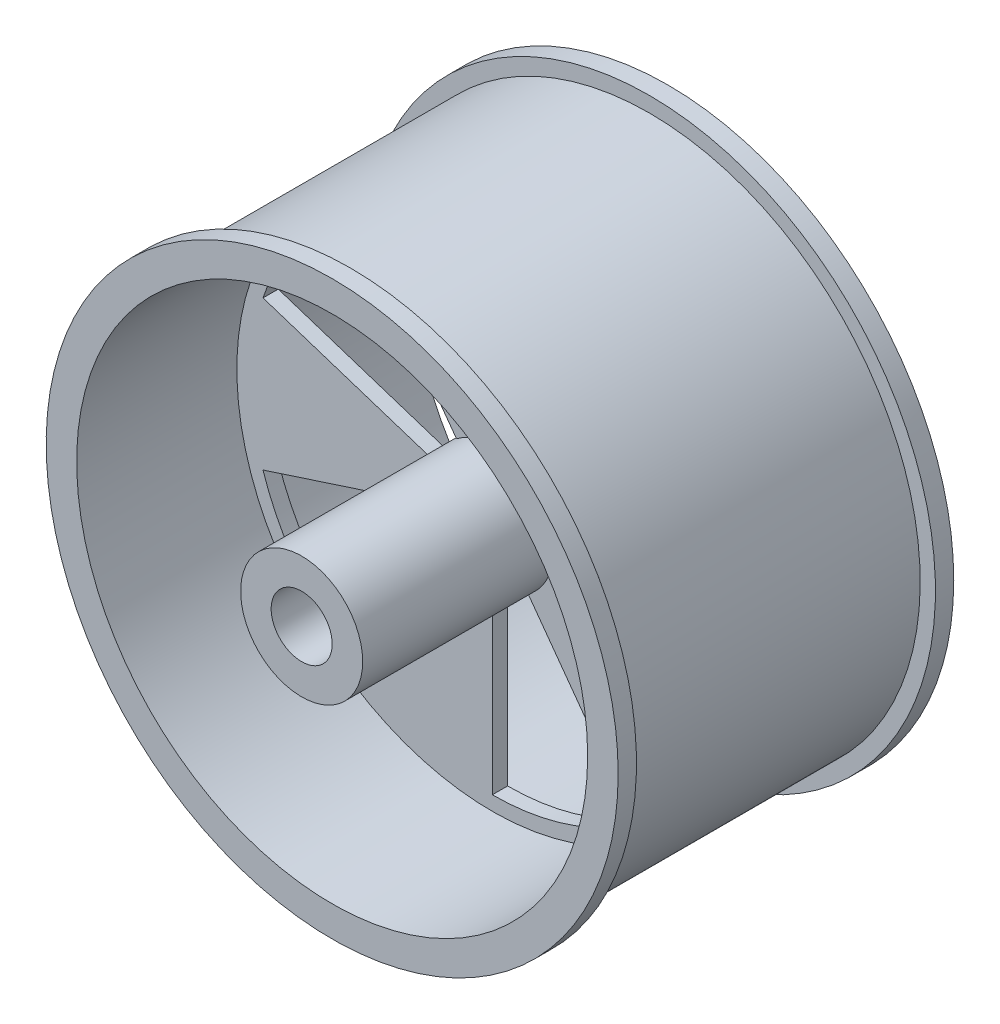
ISO-10303-21;
HEADER;
FILE_DESCRIPTION(('STEP AP214'),'2;1');
FILE_NAME('part.step','',(''),(''),'','','');
FILE_SCHEMA(('AUTOMOTIVE_DESIGN { 1 0 10303 214 1 1 1 1 }'));
ENDSEC;
DATA;
#1=APPLICATION_CONTEXT('core data for automotive mechanical design processes');
#2=APPLICATION_PROTOCOL_DEFINITION('international standard','automotive_design',2000,#1);
#3=PRODUCT_CONTEXT('',#1,'mechanical');
#4=PRODUCT('Part','Part','',(#3));
#5=PRODUCT_RELATED_PRODUCT_CATEGORY('part','',(#4));
#6=PRODUCT_DEFINITION_FORMATION('','',#4);
#7=PRODUCT_DEFINITION_CONTEXT('part definition',#1,'design');
#8=PRODUCT_DEFINITION('design','',#6,#7);
#9=PRODUCT_DEFINITION_SHAPE('','',#8);
#10=(LENGTH_UNIT() NAMED_UNIT(*) SI_UNIT(.MILLI.,.METRE.));
#11=(NAMED_UNIT(*) PLANE_ANGLE_UNIT() SI_UNIT($,.RADIAN.));
#12=(NAMED_UNIT(*) SI_UNIT($,.STERADIAN.) SOLID_ANGLE_UNIT());
#13=UNCERTAINTY_MEASURE_WITH_UNIT(LENGTH_MEASURE(1.E-05),#10,'distance_accuracy_value','');
#14=(GEOMETRIC_REPRESENTATION_CONTEXT(3) GLOBAL_UNCERTAINTY_ASSIGNED_CONTEXT((#13)) GLOBAL_UNIT_ASSIGNED_CONTEXT((#10,
#11,#12)) REPRESENTATION_CONTEXT('',''));
#15=CARTESIAN_POINT('',(0.,0.,0.));
#16=DIRECTION('',(0.,0.,1.));
#17=DIRECTION('',(1.,0.,0.));
#18=AXIS2_PLACEMENT_3D('',#15,#16,#17);
#19=CARTESIAN_POINT('',(0.,0.,14.605));
#20=DIRECTION('',(0.,0.,1.));
#21=DIRECTION('',(1.,0.,0.));
#22=AXIS2_PLACEMENT_3D('',#19,#20,#21);
#23=PLANE('',#22);
#24=CARTESIAN_POINT('',(0.,0.,14.605));
#25=DIRECTION('',(0.,0.,1.));
#26=DIRECTION('',(1.,0.,0.));
#27=AXIS2_PLACEMENT_3D('',#24,#25,#26);
#28=CIRCLE('',#27,21.2725);
#29=CARTESIAN_POINT('',(21.2725,0.,14.605));
#30=VERTEX_POINT('',#29);
#31=EDGE_CURVE('E377',#30,#30,#28,.T.);
#32=ORIENTED_EDGE('',*,*,#31,.T.);
#33=EDGE_LOOP('',(#32));
#34=FACE_BOUND('',#33,.T.);
#35=DIRECTION('',(0.951056516295152,-0.309016994374953,0.));
#36=VECTOR('',#35,1.);
#37=CARTESIAN_POINT('',(0.,0.,14.605));
#38=LINE('',#37,#36);
#39=CARTESIAN_POINT('',(4.83136710277938,-1.56980633142474,14.605));
#40=VERTEX_POINT('',#39);
#41=CARTESIAN_POINT('',(19.0936857187198,-6.20391456369309,14.605));
#42=VERTEX_POINT('',#41);
#43=EDGE_CURVE('E205',#40,#42,#38,.T.);
#44=ORIENTED_EDGE('',*,*,#43,.F.);
#45=CARTESIAN_POINT('',(0.,0.,14.605));
#46=DIRECTION('',(0.,0.,1.));
#47=DIRECTION('',(1.,0.,0.));
#48=AXIS2_PLACEMENT_3D('',#45,#46,#47);
#49=CIRCLE('',#48,5.08);
#50=CARTESIAN_POINT('',(2.98594908164576,-4.10980633142473,14.605));
#51=VERTEX_POINT('',#50);
#52=EDGE_CURVE('E196',#51,#40,#49,.T.);
#53=ORIENTED_EDGE('',*,*,#52,.F.);
#54=DIRECTION('',(-0.587785252292467,0.809016994374952,0.));
#55=VECTOR('',#54,1.);
#56=CARTESIAN_POINT('',(0.,0.,14.605));
#57=LINE('',#56,#55);
#58=CARTESIAN_POINT('',(11.8005467446771,-16.2420591910488,14.605));
#59=VERTEX_POINT('',#58);
#60=EDGE_CURVE('E394',#59,#51,#57,.T.);
#61=ORIENTED_EDGE('',*,*,#60,.F.);
#62=CARTESIAN_POINT('',(0.,0.,14.605));
#63=DIRECTION('',(0.,0.,1.));
#64=DIRECTION('',(1.,0.,0.));
#65=AXIS2_PLACEMENT_3D('',#62,#63,#64);
#66=CIRCLE('',#65,20.0762892547115);
#67=CARTESIAN_POINT('',(-1.42681005899092E-13,-20.0762892547115,14.605));
#68=VERTEX_POINT('',#67);
#69=EDGE_CURVE('E206',#68,#59,#66,.T.);
#70=ORIENTED_EDGE('',*,*,#69,.F.);
#71=DIRECTION('',(0.,-1.,0.));
#72=VECTOR('',#71,1.);
#73=CARTESIAN_POINT('',(0.,0.,14.605));
#74=LINE('',#73,#72);
#75=CARTESIAN_POINT('',(0.,-5.08,14.605));
#76=VERTEX_POINT('',#75);
#77=EDGE_CURVE('E398',#76,#68,#74,.T.);
#78=ORIENTED_EDGE('',*,*,#77,.F.);
#79=CARTESIAN_POINT('',(-2.98594908164576,-4.10980633142473,14.605));
#80=VERTEX_POINT('',#79);
#81=EDGE_CURVE('E732',#80,#76,#49,.T.);
#82=ORIENTED_EDGE('',*,*,#81,.F.);
#83=DIRECTION('',(0.587785252292483,0.80901699437494,0.));
#84=VECTOR('',#83,1.);
#85=CARTESIAN_POINT('',(0.,0.,14.605));
#86=LINE('',#85,#84);
#87=CARTESIAN_POINT('',(-11.8005467446775,-16.2420591910487,14.605));
#88=VERTEX_POINT('',#87);
#89=EDGE_CURVE('E409',#88,#80,#86,.T.);
#90=ORIENTED_EDGE('',*,*,#89,.F.);
#91=CARTESIAN_POINT('',(0.,0.,14.605));
#92=DIRECTION('',(0.,0.,1.));
#93=DIRECTION('',(1.,0.,0.));
#94=AXIS2_PLACEMENT_3D('',#91,#92,#93);
#95=CIRCLE('',#94,20.0762892547115);
#96=CARTESIAN_POINT('',(-19.0936857187198,-6.20391456369282,14.605));
#97=VERTEX_POINT('',#96);
#98=EDGE_CURVE('E415',#97,#88,#95,.T.);
#99=ORIENTED_EDGE('',*,*,#98,.F.);
#100=DIRECTION('',(-0.951056516295158,-0.309016994374935,0.));
#101=VECTOR('',#100,1.);
#102=CARTESIAN_POINT('',(0.,0.,14.605));
#103=LINE('',#102,#101);
#104=CARTESIAN_POINT('',(-4.83136710277938,-1.56980633142473,14.605));
#105=VERTEX_POINT('',#104);
#106=EDGE_CURVE('E412',#105,#97,#103,.T.);
#107=ORIENTED_EDGE('',*,*,#106,.F.);
#108=CARTESIAN_POINT('',(-4.83136710277938,1.56980633142473,14.605));
#109=VERTEX_POINT('',#108);
#110=EDGE_CURVE('E433',#109,#105,#49,.T.);
#111=ORIENTED_EDGE('',*,*,#110,.F.);
#112=DIRECTION('',(0.951056516295149,-0.309016994374962,0.));
#113=VECTOR('',#112,1.);
#114=CARTESIAN_POINT('',(0.,0.,14.605));
#115=LINE('',#114,#113);
#116=CARTESIAN_POINT('',(-19.0936857187197,6.20391456369331,14.605));
#117=VERTEX_POINT('',#116);
#118=EDGE_CURVE('E419',#117,#109,#115,.T.);
#119=ORIENTED_EDGE('',*,*,#118,.F.);
#120=CARTESIAN_POINT('',(0.,0.,14.605));
#121=DIRECTION('',(0.,0.,1.));
#122=DIRECTION('',(1.,0.,0.));
#123=AXIS2_PLACEMENT_3D('',#120,#121,#122);
#124=CIRCLE('',#123,20.0762892547115);
#125=CARTESIAN_POINT('',(-11.8005467446771,16.2420591910489,14.605));
#126=VERTEX_POINT('',#125);
#127=EDGE_CURVE('E12',#126,#117,#124,.T.);
#128=ORIENTED_EDGE('',*,*,#127,.F.);
#129=DIRECTION('',(-0.58778525229246,0.809016994374957,0.));
#130=VECTOR('',#129,1.);
#131=CARTESIAN_POINT('',(0.,0.,14.605));
#132=LINE('',#131,#130);
#133=CARTESIAN_POINT('',(-2.98594908164576,4.10980633142474,14.605));
#134=VERTEX_POINT('',#133);
#135=EDGE_CURVE('E50',#134,#126,#132,.T.);
#136=ORIENTED_EDGE('',*,*,#135,.F.);
#137=CARTESIAN_POINT('',(0.,5.08,14.605));
#138=VERTEX_POINT('',#137);
#139=EDGE_CURVE('E194',#138,#134,#49,.T.);
#140=ORIENTED_EDGE('',*,*,#139,.F.);
#141=DIRECTION('',(0.,-1.,0.));
#142=VECTOR('',#141,1.);
#143=CARTESIAN_POINT('',(0.,0.,14.605));
#144=LINE('',#143,#142);
#145=CARTESIAN_POINT('',(0.,20.0762892547115,14.605));
#146=VERTEX_POINT('',#145);
#147=EDGE_CURVE('E384',#146,#138,#144,.T.);
#148=ORIENTED_EDGE('',*,*,#147,.F.);
#149=CARTESIAN_POINT('',(0.,0.,14.605));
#150=DIRECTION('',(0.,0.,1.));
#151=DIRECTION('',(1.,0.,0.));
#152=AXIS2_PLACEMENT_3D('',#149,#150,#151);
#153=CIRCLE('',#152,20.0762892547115);
#154=CARTESIAN_POINT('',(11.8005467446773,16.2420591910488,14.605));
#155=VERTEX_POINT('',#154);
#156=EDGE_CURVE('E390',#155,#146,#153,.T.);
#157=ORIENTED_EDGE('',*,*,#156,.F.);
#158=DIRECTION('',(0.587785252292474,0.809016994374947,0.));
#159=VECTOR('',#158,1.);
#160=CARTESIAN_POINT('',(0.,0.,14.605));
#161=LINE('',#160,#159);
#162=CARTESIAN_POINT('',(2.98594908164577,4.10980633142473,14.605));
#163=VERTEX_POINT('',#162);
#164=EDGE_CURVE('E187',#163,#155,#161,.T.);
#165=ORIENTED_EDGE('',*,*,#164,.F.);
#166=CARTESIAN_POINT('',(4.83136710277938,1.56980633142473,14.605));
#167=VERTEX_POINT('',#166);
#168=EDGE_CURVE('E181',#167,#163,#49,.T.);
#169=ORIENTED_EDGE('',*,*,#168,.F.);
#170=DIRECTION('',(-0.951056516295155,-0.309016994374944,0.));
#171=VECTOR('',#170,1.);
#172=CARTESIAN_POINT('',(0.,0.,14.605));
#173=LINE('',#172,#171);
#174=CARTESIAN_POINT('',(19.0936857187198,6.20391456369294,14.605));
#175=VERTEX_POINT('',#174);
#176=EDGE_CURVE('E185',#175,#167,#173,.T.);
#177=ORIENTED_EDGE('',*,*,#176,.F.);
#178=CARTESIAN_POINT('',(0.,0.,14.605));
#179=DIRECTION('',(0.,0.,1.));
#180=DIRECTION('',(1.,0.,0.));
#181=AXIS2_PLACEMENT_3D('',#178,#179,#180);
#182=CIRCLE('',#181,20.0762892547115);
#183=EDGE_CURVE('E406',#42,#175,#182,.T.);
#184=ORIENTED_EDGE('',*,*,#183,.F.);
#185=EDGE_LOOP('',(#44,#53,#61,#70,#78,#82,#90,#99,#107,#111,#119,#128,#136,#140,#148,#157,#165,
#169,#177,#184));
#186=FACE_BOUND('',#185,.T.);
#187=ADVANCED_FACE('F41',(#34,#186),#23,.T.);
#188=CARTESIAN_POINT('',(0.,0.,27.94));
#189=DIRECTION('',(0.,0.,-1.));
#190=DIRECTION('',(-1.,0.,0.));
#191=AXIS2_PLACEMENT_3D('',#188,#189,#190);
#192=CYLINDRICAL_SURFACE('',#191,21.2725);
#193=CARTESIAN_POINT('',(0.,0.,0.));
#194=DIRECTION('',(0.,0.,1.));
#195=DIRECTION('',(1.,0.,0.));
#196=AXIS2_PLACEMENT_3D('',#193,#194,#195);
#197=CIRCLE('',#196,21.2725);
#198=CARTESIAN_POINT('',(21.2725,0.,0.));
#199=VERTEX_POINT('',#198);
#200=EDGE_CURVE('E364',#199,#199,#197,.T.);
#201=ORIENTED_EDGE('',*,*,#200,.F.);
#202=EDGE_LOOP('',(#201));
#203=FACE_BOUND('',#202,.T.);
#204=CARTESIAN_POINT('',(0.,0.,13.335));
#205=DIRECTION('',(0.,0.,1.));
#206=DIRECTION('',(1.,0.,0.));
#207=AXIS2_PLACEMENT_3D('',#204,#205,#206);
#208=CIRCLE('',#207,21.2725);
#209=CARTESIAN_POINT('',(21.2725,0.,13.335));
#210=VERTEX_POINT('',#209);
#211=EDGE_CURVE('E344',#210,#210,#208,.T.);
#212=ORIENTED_EDGE('',*,*,#211,.T.);
#213=EDGE_LOOP('',(#212));
#214=FACE_BOUND('',#213,.T.);
#215=ADVANCED_FACE('F450',(#203,#214),#192,.F.);
#216=CARTESIAN_POINT('',(0.,0.,27.94));
#217=DIRECTION('',(0.,0.,-1.));
#218=DIRECTION('',(-1.,0.,0.));
#219=AXIS2_PLACEMENT_3D('',#216,#217,#218);
#220=CYLINDRICAL_SURFACE('',#219,23.8125);
#221=CARTESIAN_POINT('',(0.,0.,1.524));
#222=DIRECTION('',(0.,0.,-1.));
#223=DIRECTION('',(0.,1.,0.));
#224=AXIS2_PLACEMENT_3D('',#221,#222,#223);
#225=CIRCLE('',#224,23.8125);
#226=CARTESIAN_POINT('',(0.,23.8125,1.524));
#227=VERTEX_POINT('',#226);
#228=EDGE_CURVE('E348',#227,#227,#225,.T.);
#229=ORIENTED_EDGE('',*,*,#228,.T.);
#230=EDGE_LOOP('',(#229));
#231=FACE_BOUND('',#230,.T.);
#232=CARTESIAN_POINT('',(0.,0.,0.));
#233=DIRECTION('',(0.,0.,1.));
#234=DIRECTION('',(1.,0.,0.));
#235=AXIS2_PLACEMENT_3D('',#232,#233,#234);
#236=CIRCLE('',#235,23.8125);
#237=CARTESIAN_POINT('',(23.8125,0.,0.));
#238=VERTEX_POINT('',#237);
#239=EDGE_CURVE('E369',#238,#238,#236,.T.);
#240=ORIENTED_EDGE('',*,*,#239,.T.);
#241=EDGE_LOOP('',(#240));
#242=FACE_BOUND('',#241,.T.);
#243=ADVANCED_FACE('F452',(#231,#242),#220,.T.);
#244=CARTESIAN_POINT('',(0.,0.,27.94));
#245=DIRECTION('',(0.,0.,1.));
#246=DIRECTION('',(1.,0.,0.));
#247=AXIS2_PLACEMENT_3D('',#244,#245,#246);
#248=PLANE('',#247);
#249=CARTESIAN_POINT('',(0.,0.,27.94));
#250=DIRECTION('',(0.,0.,1.));
#251=DIRECTION('',(1.,0.,0.));
#252=AXIS2_PLACEMENT_3D('',#249,#250,#251);
#253=CIRCLE('',#252,23.8125);
#254=CARTESIAN_POINT('',(23.8125,0.,27.94));
#255=VERTEX_POINT('',#254);
#256=EDGE_CURVE('E373',#255,#255,#253,.T.);
#257=ORIENTED_EDGE('',*,*,#256,.T.);
#258=EDGE_LOOP('',(#257));
#259=FACE_BOUND('',#258,.T.);
#260=CARTESIAN_POINT('',(0.,0.,27.94));
#261=DIRECTION('',(0.,0.,1.));
#262=DIRECTION('',(1.,0.,0.));
#263=AXIS2_PLACEMENT_3D('',#260,#261,#262);
#264=CIRCLE('',#263,21.2725);
#265=CARTESIAN_POINT('',(21.2725,0.,27.94));
#266=VERTEX_POINT('',#265);
#267=EDGE_CURVE('E365',#266,#266,#264,.T.);
#268=ORIENTED_EDGE('',*,*,#267,.F.);
#269=EDGE_LOOP('',(#268));
#270=FACE_BOUND('',#269,.T.);
#271=ADVANCED_FACE('F460',(#259,#270),#248,.T.);
#272=CARTESIAN_POINT('',(0.,0.,0.));
#273=DIRECTION('',(0.,0.,1.));
#274=DIRECTION('',(1.,0.,0.));
#275=AXIS2_PLACEMENT_3D('',#272,#273,#274);
#276=PLANE('',#275);
#277=ORIENTED_EDGE('',*,*,#239,.F.);
#278=EDGE_LOOP('',(#277));
#279=FACE_BOUND('',#278,.T.);
#280=ORIENTED_EDGE('',*,*,#200,.T.);
#281=EDGE_LOOP('',(#280));
#282=FACE_BOUND('',#281,.T.);
#283=ADVANCED_FACE('F476',(#279,#282),#276,.F.);
#284=CARTESIAN_POINT('',(0.,0.,26.416));
#285=DIRECTION('',(0.,0.,-1.));
#286=DIRECTION('',(0.,1.,0.));
#287=AXIS2_PLACEMENT_3D('',#284,#285,#286);
#288=CIRCLE('',#287,23.8125);
#289=CARTESIAN_POINT('',(0.,23.8125,26.416));
#290=VERTEX_POINT('',#289);
#291=EDGE_CURVE('E352',#290,#290,#288,.T.);
#292=ORIENTED_EDGE('',*,*,#291,.F.);
#293=EDGE_LOOP('',(#292));
#294=FACE_BOUND('',#293,.T.);
#295=ORIENTED_EDGE('',*,*,#256,.F.);
#296=EDGE_LOOP('',(#295));
#297=FACE_BOUND('',#296,.T.);
#298=ADVANCED_FACE('F43',(#294,#297),#220,.T.);
#299=ORIENTED_EDGE('',*,*,#31,.F.);
#300=EDGE_LOOP('',(#299));
#301=FACE_BOUND('',#300,.T.);
#302=ORIENTED_EDGE('',*,*,#267,.T.);
#303=EDGE_LOOP('',(#302));
#304=FACE_BOUND('',#303,.T.);
#305=ADVANCED_FACE('F455',(#301,#304),#192,.F.);
#306=CARTESIAN_POINT('',(0.,23.8125,1.524));
#307=DIRECTION('',(0.,0.,-1.));
#308=DIRECTION('',(0.,1.,0.));
#309=AXIS2_PLACEMENT_3D('',#306,#307,#308);
#310=PLANE('',#309);
#311=ORIENTED_EDGE('',*,*,#228,.F.);
#312=EDGE_LOOP('',(#311));
#313=FACE_BOUND('',#312,.T.);
#314=CARTESIAN_POINT('',(0.,0.,1.524));
#315=DIRECTION('',(0.,0.,-1.));
#316=DIRECTION('',(0.,1.,0.));
#317=AXIS2_PLACEMENT_3D('',#314,#315,#316);
#318=CIRCLE('',#317,22.5425);
#319=CARTESIAN_POINT('',(0.,22.5425,1.524));
#320=VERTEX_POINT('',#319);
#321=EDGE_CURVE('E360',#320,#320,#318,.T.);
#322=ORIENTED_EDGE('',*,*,#321,.T.);
#323=EDGE_LOOP('',(#322));
#324=FACE_BOUND('',#323,.T.);
#325=ADVANCED_FACE('F468',(#313,#324),#310,.F.);
#326=CARTESIAN_POINT('',(0.,0.,0.));
#327=DIRECTION('',(0.,0.,-1.));
#328=DIRECTION('',(0.,1.,0.));
#329=AXIS2_PLACEMENT_3D('',#326,#327,#328);
#330=CYLINDRICAL_SURFACE('',#329,22.5425);
#331=ORIENTED_EDGE('',*,*,#321,.F.);
#332=EDGE_LOOP('',(#331));
#333=FACE_BOUND('',#332,.T.);
#334=CARTESIAN_POINT('',(0.,0.,26.416));
#335=DIRECTION('',(0.,0.,-1.));
#336=DIRECTION('',(0.,1.,0.));
#337=AXIS2_PLACEMENT_3D('',#334,#335,#336);
#338=CIRCLE('',#337,22.5425);
#339=CARTESIAN_POINT('',(0.,22.5425,26.416));
#340=VERTEX_POINT('',#339);
#341=EDGE_CURVE('E356',#340,#340,#338,.T.);
#342=ORIENTED_EDGE('',*,*,#341,.T.);
#343=EDGE_LOOP('',(#342));
#344=FACE_BOUND('',#343,.T.);
#345=ADVANCED_FACE('F474',(#333,#344),#330,.T.);
#346=CARTESIAN_POINT('',(0.,23.8125,26.416));
#347=DIRECTION('',(0.,0.,1.));
#348=DIRECTION('',(0.,-1.,0.));
#349=AXIS2_PLACEMENT_3D('',#346,#347,#348);
#350=PLANE('',#349);
#351=ORIENTED_EDGE('',*,*,#341,.F.);
#352=EDGE_LOOP('',(#351));
#353=FACE_BOUND('',#352,.T.);
#354=ORIENTED_EDGE('',*,*,#291,.T.);
#355=EDGE_LOOP('',(#354));
#356=FACE_BOUND('',#355,.T.);
#357=ADVANCED_FACE('F441',(#353,#356),#350,.F.);
#358=CARTESIAN_POINT('',(0.,0.,13.335));
#359=DIRECTION('',(0.,0.,1.));
#360=DIRECTION('',(1.,0.,0.));
#361=AXIS2_PLACEMENT_3D('',#358,#359,#360);
#362=PLANE('',#361);
#363=CARTESIAN_POINT('',(0.,0.,13.335));
#364=DIRECTION('',(0.,0.,1.));
#365=DIRECTION('',(1.,0.,0.));
#366=AXIS2_PLACEMENT_3D('',#363,#364,#365);
#367=CIRCLE('',#366,2.54);
#368=CARTESIAN_POINT('',(2.54,0.,13.335));
#369=VERTEX_POINT('',#368);
#370=EDGE_CURVE('E727',#369,#369,#367,.T.);
#371=ORIENTED_EDGE('',*,*,#370,.T.);
#372=EDGE_LOOP('',(#371));
#373=FACE_BOUND('',#372,.T.);
#374=DIRECTION('',(-0.58778525229246,0.809016994374957,0.));
#375=VECTOR('',#374,1.);
#376=CARTESIAN_POINT('',(0.,0.,13.335));
#377=LINE('',#376,#375);
#378=CARTESIAN_POINT('',(-2.98594908164576,4.10980633142474,13.335));
#379=VERTEX_POINT('',#378);
#380=CARTESIAN_POINT('',(-11.8005467446771,16.2420591910489,13.335));
#381=VERTEX_POINT('',#380);
#382=EDGE_CURVE('E336',#379,#381,#377,.T.);
#383=ORIENTED_EDGE('',*,*,#382,.T.);
#384=CARTESIAN_POINT('',(0.,0.,13.335));
#385=DIRECTION('',(0.,0.,1.));
#386=DIRECTION('',(1.,0.,0.));
#387=AXIS2_PLACEMENT_3D('',#384,#385,#386);
#388=CIRCLE('',#387,20.0762892547115);
#389=CARTESIAN_POINT('',(-19.0936857187197,6.20391456369323,13.335));
#390=VERTEX_POINT('',#389);
#391=EDGE_CURVE('E340',#381,#390,#388,.T.);
#392=ORIENTED_EDGE('',*,*,#391,.T.);
#393=DIRECTION('',(0.951056516295149,-0.309016994374962,0.));
#394=VECTOR('',#393,1.);
#395=CARTESIAN_POINT('',(0.,0.,13.335));
#396=LINE('',#395,#394);
#397=CARTESIAN_POINT('',(-4.83136710277938,1.56980633142482,13.335));
#398=VERTEX_POINT('',#397);
#399=EDGE_CURVE('E328',#390,#398,#396,.T.);
#400=ORIENTED_EDGE('',*,*,#399,.T.);
#401=CARTESIAN_POINT('',(0.,0.,13.335));
#402=DIRECTION('',(0.,0.,1.));
#403=DIRECTION('',(1.,0.,0.));
#404=AXIS2_PLACEMENT_3D('',#401,#402,#403);
#405=CIRCLE('',#404,5.08);
#406=EDGE_CURVE('E332',#398,#379,#405,.F.);
#407=ORIENTED_EDGE('',*,*,#406,.T.);
#408=EDGE_LOOP('',(#383,#392,#400,#407));
#409=FACE_BOUND('',#408,.T.);
#410=DIRECTION('',(-0.951056516295158,-0.309016994374935,0.));
#411=VECTOR('',#410,1.);
#412=CARTESIAN_POINT('',(0.,0.,13.335));
#413=LINE('',#412,#411);
#414=CARTESIAN_POINT('',(-4.83136710277938,-1.56980633142473,13.335));
#415=VERTEX_POINT('',#414);
#416=CARTESIAN_POINT('',(-19.0936857187198,-6.20391456369282,13.335));
#417=VERTEX_POINT('',#416);
#418=EDGE_CURVE('E320',#415,#417,#413,.T.);
#419=ORIENTED_EDGE('',*,*,#418,.T.);
#420=CARTESIAN_POINT('',(0.,0.,13.335));
#421=DIRECTION('',(0.,0.,1.));
#422=DIRECTION('',(1.,0.,0.));
#423=AXIS2_PLACEMENT_3D('',#420,#421,#422);
#424=CIRCLE('',#423,20.0762892547115);
#425=CARTESIAN_POINT('',(-11.8005467446774,-16.2420591910487,13.335));
#426=VERTEX_POINT('',#425);
#427=EDGE_CURVE('E324',#417,#426,#424,.T.);
#428=ORIENTED_EDGE('',*,*,#427,.T.);
#429=DIRECTION('',(0.587785252292483,0.80901699437494,0.));
#430=VECTOR('',#429,1.);
#431=CARTESIAN_POINT('',(0.,0.,13.335));
#432=LINE('',#431,#430);
#433=CARTESIAN_POINT('',(-2.98594908164584,-4.10980633142473,13.335));
#434=VERTEX_POINT('',#433);
#435=EDGE_CURVE('E312',#426,#434,#432,.T.);
#436=ORIENTED_EDGE('',*,*,#435,.T.);
#437=CARTESIAN_POINT('',(0.,0.,13.335));
#438=DIRECTION('',(0.,0.,1.));
#439=DIRECTION('',(1.,0.,0.));
#440=AXIS2_PLACEMENT_3D('',#437,#438,#439);
#441=CIRCLE('',#440,5.08);
#442=EDGE_CURVE('E316',#434,#415,#441,.F.);
#443=ORIENTED_EDGE('',*,*,#442,.T.);
#444=EDGE_LOOP('',(#419,#428,#436,#443));
#445=FACE_BOUND('',#444,.T.);
#446=DIRECTION('',(0.951056516295152,-0.309016994374953,0.));
#447=VECTOR('',#446,1.);
#448=CARTESIAN_POINT('',(0.,0.,13.335));
#449=LINE('',#448,#447);
#450=CARTESIAN_POINT('',(4.83136710277938,-1.56980633142474,13.335));
#451=VERTEX_POINT('',#450);
#452=CARTESIAN_POINT('',(19.0936857187198,-6.20391456369309,13.335));
#453=VERTEX_POINT('',#452);
#454=EDGE_CURVE('E304',#451,#453,#449,.T.);
#455=ORIENTED_EDGE('',*,*,#454,.T.);
#456=CARTESIAN_POINT('',(0.,0.,13.335));
#457=DIRECTION('',(0.,0.,1.));
#458=DIRECTION('',(1.,0.,0.));
#459=AXIS2_PLACEMENT_3D('',#456,#457,#458);
#460=CIRCLE('',#459,20.0762892547115);
#461=CARTESIAN_POINT('',(19.0936857187198,6.20391456369296,13.335));
#462=VERTEX_POINT('',#461);
#463=EDGE_CURVE('E308',#453,#462,#460,.T.);
#464=ORIENTED_EDGE('',*,*,#463,.T.);
#465=DIRECTION('',(-0.951056516295155,-0.309016994374944,0.));
#466=VECTOR('',#465,1.);
#467=CARTESIAN_POINT('',(0.,0.,13.335));
#468=LINE('',#467,#466);
#469=CARTESIAN_POINT('',(4.83136710277938,1.56980633142471,13.335));
#470=VERTEX_POINT('',#469);
#471=EDGE_CURVE('E299',#462,#470,#468,.T.);
#472=ORIENTED_EDGE('',*,*,#471,.T.);
#473=CARTESIAN_POINT('',(0.,0.,13.335));
#474=DIRECTION('',(0.,0.,1.));
#475=DIRECTION('',(1.,0.,0.));
#476=AXIS2_PLACEMENT_3D('',#473,#474,#475);
#477=CIRCLE('',#476,5.08);
#478=EDGE_CURVE('E212',#470,#451,#477,.F.);
#479=ORIENTED_EDGE('',*,*,#478,.T.);
#480=EDGE_LOOP('',(#455,#464,#472,#479));
#481=FACE_BOUND('',#480,.T.);
#482=DIRECTION('',(0.,-1.,0.));
#483=VECTOR('',#482,1.);
#484=CARTESIAN_POINT('',(0.,0.,13.335));
#485=LINE('',#484,#483);
#486=CARTESIAN_POINT('',(0.,-5.08,13.335));
#487=VERTEX_POINT('',#486);
#488=CARTESIAN_POINT('',(-1.42681005899092E-13,-20.0762892547115,13.335));
#489=VERTEX_POINT('',#488);
#490=EDGE_CURVE('E291',#487,#489,#485,.T.);
#491=ORIENTED_EDGE('',*,*,#490,.T.);
#492=CARTESIAN_POINT('',(0.,0.,13.335));
#493=DIRECTION('',(0.,0.,1.));
#494=DIRECTION('',(1.,0.,0.));
#495=AXIS2_PLACEMENT_3D('',#492,#493,#494);
#496=CIRCLE('',#495,20.0762892547115);
#497=CARTESIAN_POINT('',(11.8005467446772,-16.2420591910488,13.335));
#498=VERTEX_POINT('',#497);
#499=EDGE_CURVE('E295',#489,#498,#496,.T.);
#500=ORIENTED_EDGE('',*,*,#499,.T.);
#501=DIRECTION('',(-0.587785252292467,0.809016994374952,0.));
#502=VECTOR('',#501,1.);
#503=CARTESIAN_POINT('',(0.,0.,13.335));
#504=LINE('',#503,#502);
#505=CARTESIAN_POINT('',(2.98594908164572,-4.10980633142473,13.335));
#506=VERTEX_POINT('',#505);
#507=EDGE_CURVE('E283',#498,#506,#504,.T.);
#508=ORIENTED_EDGE('',*,*,#507,.T.);
#509=CARTESIAN_POINT('',(0.,0.,13.335));
#510=DIRECTION('',(0.,0.,1.));
#511=DIRECTION('',(1.,0.,0.));
#512=AXIS2_PLACEMENT_3D('',#509,#510,#511);
#513=CIRCLE('',#512,5.08);
#514=EDGE_CURVE('E287',#506,#487,#513,.F.);
#515=ORIENTED_EDGE('',*,*,#514,.T.);
#516=EDGE_LOOP('',(#491,#500,#508,#515));
#517=FACE_BOUND('',#516,.T.);
#518=DIRECTION('',(0.587785252292474,0.809016994374947,0.));
#519=VECTOR('',#518,1.);
#520=CARTESIAN_POINT('',(0.,0.,13.335));
#521=LINE('',#520,#519);
#522=CARTESIAN_POINT('',(2.98594908164577,4.10980633142473,13.335));
#523=VERTEX_POINT('',#522);
#524=CARTESIAN_POINT('',(11.8005467446773,16.2420591910488,13.335));
#525=VERTEX_POINT('',#524);
#526=EDGE_CURVE('E275',#523,#525,#521,.T.);
#527=ORIENTED_EDGE('',*,*,#526,.T.);
#528=CARTESIAN_POINT('',(0.,0.,13.335));
#529=DIRECTION('',(0.,0.,1.));
#530=DIRECTION('',(1.,0.,0.));
#531=AXIS2_PLACEMENT_3D('',#528,#529,#530);
#532=CIRCLE('',#531,20.0762892547115);
#533=CARTESIAN_POINT('',(0.,20.0762892547115,13.335));
#534=VERTEX_POINT('',#533);
#535=EDGE_CURVE('E279',#525,#534,#532,.T.);
#536=ORIENTED_EDGE('',*,*,#535,.T.);
#537=DIRECTION('',(0.,-1.,0.));
#538=VECTOR('',#537,1.);
#539=CARTESIAN_POINT('',(0.,0.,13.335));
#540=LINE('',#539,#538);
#541=CARTESIAN_POINT('',(0.,5.08,13.335));
#542=VERTEX_POINT('',#541);
#543=EDGE_CURVE('E257',#534,#542,#540,.T.);
#544=ORIENTED_EDGE('',*,*,#543,.T.);
#545=CARTESIAN_POINT('',(0.,0.,13.335));
#546=DIRECTION('',(0.,0.,1.));
#547=DIRECTION('',(1.,0.,0.));
#548=AXIS2_PLACEMENT_3D('',#545,#546,#547);
#549=CIRCLE('',#548,5.08);
#550=EDGE_CURVE('E271',#542,#523,#549,.F.);
#551=ORIENTED_EDGE('',*,*,#550,.T.);
#552=EDGE_LOOP('',(#527,#536,#544,#551));
#553=FACE_BOUND('',#552,.T.);
#554=ORIENTED_EDGE('',*,*,#211,.F.);
#555=EDGE_LOOP('',(#554));
#556=FACE_BOUND('',#555,.T.);
#557=ADVANCED_FACE('F437',(#373,#409,#445,#481,#517,#553,#556),#362,.F.);
#558=CARTESIAN_POINT('',(0.,0.,0.));
#559=DIRECTION('',(0.,0.,1.));
#560=DIRECTION('',(1.,0.,0.));
#561=AXIS2_PLACEMENT_3D('',#558,#559,#560);
#562=CYLINDRICAL_SURFACE('',#561,20.0762892547115);
#563=DIRECTION('',(0.,0.,1.));
#564=VECTOR('',#563,1.);
#565=CARTESIAN_POINT('',(11.8005467446773,16.2420591910488,0.));
#566=LINE('',#565,#564);
#567=EDGE_CURVE('E253',#525,#155,#566,.T.);
#568=ORIENTED_EDGE('',*,*,#567,.T.);
#569=ORIENTED_EDGE('',*,*,#156,.T.);
#570=DIRECTION('',(0.,0.,1.));
#571=VECTOR('',#570,1.);
#572=CARTESIAN_POINT('',(0.,20.0762892547115,0.));
#573=LINE('',#572,#571);
#574=EDGE_CURVE('E265',#534,#146,#573,.T.);
#575=ORIENTED_EDGE('',*,*,#574,.F.);
#576=ORIENTED_EDGE('',*,*,#535,.F.);
#577=EDGE_LOOP('',(#568,#569,#575,#576));
#578=FACE_BOUND('',#577,.T.);
#579=ADVANCED_FACE('F440',(#578),#562,.F.);
#580=CARTESIAN_POINT('',(2.98594908164577,4.10980633142473,0.));
#581=DIRECTION('',(0.809016994374947,-0.587785252292474,0.));
#582=DIRECTION('',(0.587785252292474,0.809016994374947,0.));
#583=AXIS2_PLACEMENT_3D('',#580,#581,#582);
#584=PLANE('',#583);
#585=DIRECTION('',(0.,0.,1.));
#586=VECTOR('',#585,1.);
#587=CARTESIAN_POINT('',(2.98594908164577,4.10980633142473,0.));
#588=LINE('',#587,#586);
#589=EDGE_CURVE('E258',#523,#163,#588,.T.);
#590=ORIENTED_EDGE('',*,*,#589,.T.);
#591=ORIENTED_EDGE('',*,*,#164,.T.);
#592=ORIENTED_EDGE('',*,*,#567,.F.);
#593=ORIENTED_EDGE('',*,*,#526,.F.);
#594=EDGE_LOOP('',(#590,#591,#592,#593));
#595=FACE_BOUND('',#594,.T.);
#596=ADVANCED_FACE('F544',(#595),#584,.F.);
#597=CARTESIAN_POINT('',(0.,5.08,0.));
#598=DIRECTION('',(-1.,0.,0.));
#599=DIRECTION('',(0.,0.,1.));
#600=AXIS2_PLACEMENT_3D('',#597,#598,#599);
#601=PLANE('',#600);
#602=ORIENTED_EDGE('',*,*,#574,.T.);
#603=ORIENTED_EDGE('',*,*,#147,.T.);
#604=DIRECTION('',(0.,0.,1.));
#605=VECTOR('',#604,1.);
#606=CARTESIAN_POINT('',(0.,5.08,0.));
#607=LINE('',#606,#605);
#608=EDGE_CURVE('E261',#542,#138,#607,.T.);
#609=ORIENTED_EDGE('',*,*,#608,.F.);
#610=ORIENTED_EDGE('',*,*,#543,.F.);
#611=EDGE_LOOP('',(#602,#603,#609,#610));
#612=FACE_BOUND('',#611,.T.);
#613=ADVANCED_FACE('F558',(#612),#601,.F.);
#614=CARTESIAN_POINT('',(0.,0.,0.));
#615=DIRECTION('',(0.,0.,1.));
#616=DIRECTION('',(1.,0.,0.));
#617=AXIS2_PLACEMENT_3D('',#614,#615,#616);
#618=CYLINDRICAL_SURFACE('',#617,20.0762892547115);
#619=DIRECTION('',(0.,0.,1.));
#620=VECTOR('',#619,1.);
#621=CARTESIAN_POINT('',(-1.42681005899092E-13,-20.0762892547115,0.));
#622=LINE('',#621,#620);
#623=EDGE_CURVE('E222',#489,#68,#622,.T.);
#624=ORIENTED_EDGE('',*,*,#623,.T.);
#625=ORIENTED_EDGE('',*,*,#69,.T.);
#626=DIRECTION('',(0.,0.,1.));
#627=VECTOR('',#626,1.);
#628=CARTESIAN_POINT('',(11.8005467446772,-16.2420591910488,0.));
#629=LINE('',#628,#627);
#630=EDGE_CURVE('E230',#498,#59,#629,.T.);
#631=ORIENTED_EDGE('',*,*,#630,.F.);
#632=ORIENTED_EDGE('',*,*,#499,.F.);
#633=EDGE_LOOP('',(#624,#625,#631,#632));
#634=FACE_BOUND('',#633,.T.);
#635=ADVANCED_FACE('F552',(#634),#618,.F.);
#636=CARTESIAN_POINT('',(0.,-5.08,0.));
#637=DIRECTION('',(-1.,0.,0.));
#638=DIRECTION('',(0.,-1.,0.));
#639=AXIS2_PLACEMENT_3D('',#636,#637,#638);
#640=PLANE('',#639);
#641=DIRECTION('',(0.,0.,1.));
#642=VECTOR('',#641,1.);
#643=CARTESIAN_POINT('',(0.,-5.08,0.));
#644=LINE('',#643,#642);
#645=EDGE_CURVE('E741',#487,#76,#644,.T.);
#646=ORIENTED_EDGE('',*,*,#645,.T.);
#647=ORIENTED_EDGE('',*,*,#77,.T.);
#648=ORIENTED_EDGE('',*,*,#623,.F.);
#649=ORIENTED_EDGE('',*,*,#490,.F.);
#650=EDGE_LOOP('',(#646,#647,#648,#649));
#651=FACE_BOUND('',#650,.T.);
#652=ADVANCED_FACE('F557',(#651),#640,.F.);
#653=CARTESIAN_POINT('',(2.98594908164576,-4.10980633142473,0.));
#654=DIRECTION('',(0.809016994374952,0.587785252292467,0.));
#655=DIRECTION('',(-0.587785252292467,0.809016994374952,0.));
#656=AXIS2_PLACEMENT_3D('',#653,#654,#655);
#657=PLANE('',#656);
#658=ORIENTED_EDGE('',*,*,#630,.T.);
#659=ORIENTED_EDGE('',*,*,#60,.T.);
#660=DIRECTION('',(0.,0.,1.));
#661=VECTOR('',#660,1.);
#662=CARTESIAN_POINT('',(2.98594908164576,-4.10980633142473,0.));
#663=LINE('',#662,#661);
#664=EDGE_CURVE('E745',#506,#51,#663,.T.);
#665=ORIENTED_EDGE('',*,*,#664,.F.);
#666=ORIENTED_EDGE('',*,*,#507,.F.);
#667=EDGE_LOOP('',(#658,#659,#665,#666));
#668=FACE_BOUND('',#667,.T.);
#669=ADVANCED_FACE('F574',(#668),#657,.F.);
#670=CARTESIAN_POINT('',(0.,0.,0.));
#671=DIRECTION('',(0.,0.,1.));
#672=DIRECTION('',(1.,0.,0.));
#673=AXIS2_PLACEMENT_3D('',#670,#671,#672);
#674=CYLINDRICAL_SURFACE('',#673,20.0762892547115);
#675=DIRECTION('',(0.,0.,1.));
#676=VECTOR('',#675,1.);
#677=CARTESIAN_POINT('',(19.0936857187198,-6.20391456369309,0.));
#678=LINE('',#677,#676);
#679=EDGE_CURVE('E220',#453,#42,#678,.T.);
#680=ORIENTED_EDGE('',*,*,#679,.T.);
#681=ORIENTED_EDGE('',*,*,#183,.T.);
#682=DIRECTION('',(0.,0.,1.));
#683=VECTOR('',#682,1.);
#684=CARTESIAN_POINT('',(19.0936857187198,6.20391456369296,0.));
#685=LINE('',#684,#683);
#686=EDGE_CURVE('E202',#462,#175,#685,.T.);
#687=ORIENTED_EDGE('',*,*,#686,.F.);
#688=ORIENTED_EDGE('',*,*,#463,.F.);
#689=EDGE_LOOP('',(#680,#681,#687,#688));
#690=FACE_BOUND('',#689,.T.);
#691=ADVANCED_FACE('F568',(#690),#674,.F.);
#692=CARTESIAN_POINT('',(4.83136710277938,-1.56980633142474,0.));
#693=DIRECTION('',(-0.309016994374952,-0.951056516295152,0.));
#694=DIRECTION('',(0.951056516295152,-0.309016994374953,0.));
#695=AXIS2_PLACEMENT_3D('',#692,#693,#694);
#696=PLANE('',#695);
#697=DIRECTION('',(0.,0.,1.));
#698=VECTOR('',#697,1.);
#699=CARTESIAN_POINT('',(4.83136710277938,-1.56980633142474,0.));
#700=LINE('',#699,#698);
#701=EDGE_CURVE('E215',#451,#40,#700,.T.);
#702=ORIENTED_EDGE('',*,*,#701,.T.);
#703=ORIENTED_EDGE('',*,*,#43,.T.);
#704=ORIENTED_EDGE('',*,*,#679,.F.);
#705=ORIENTED_EDGE('',*,*,#454,.F.);
#706=EDGE_LOOP('',(#702,#703,#704,#705));
#707=FACE_BOUND('',#706,.T.);
#708=ADVANCED_FACE('F573',(#707),#696,.F.);
#709=CARTESIAN_POINT('',(4.83136710277938,1.56980633142473,0.));
#710=DIRECTION('',(-0.309016994374944,0.951056516295155,0.));
#711=DIRECTION('',(-0.951056516295155,-0.309016994374944,0.));
#712=AXIS2_PLACEMENT_3D('',#709,#710,#711);
#713=PLANE('',#712);
#714=ORIENTED_EDGE('',*,*,#686,.T.);
#715=ORIENTED_EDGE('',*,*,#176,.T.);
#716=DIRECTION('',(0.,0.,1.));
#717=VECTOR('',#716,1.);
#718=CARTESIAN_POINT('',(4.83136710277938,1.56980633142473,0.));
#719=LINE('',#718,#717);
#720=EDGE_CURVE('E199',#470,#167,#719,.T.);
#721=ORIENTED_EDGE('',*,*,#720,.F.);
#722=ORIENTED_EDGE('',*,*,#471,.F.);
#723=EDGE_LOOP('',(#714,#715,#721,#722));
#724=FACE_BOUND('',#723,.T.);
#725=ADVANCED_FACE('F198',(#724),#713,.F.);
#726=CARTESIAN_POINT('',(0.,0.,0.));
#727=DIRECTION('',(0.,0.,1.));
#728=DIRECTION('',(1.,0.,0.));
#729=AXIS2_PLACEMENT_3D('',#726,#727,#728);
#730=CYLINDRICAL_SURFACE('',#729,20.0762892547115);
#731=DIRECTION('',(0.,0.,1.));
#732=VECTOR('',#731,1.);
#733=CARTESIAN_POINT('',(-19.0936857187198,-6.20391456369282,0.));
#734=LINE('',#733,#732);
#735=EDGE_CURVE('E226',#417,#97,#734,.T.);
#736=ORIENTED_EDGE('',*,*,#735,.T.);
#737=ORIENTED_EDGE('',*,*,#98,.T.);
#738=DIRECTION('',(0.,0.,1.));
#739=VECTOR('',#738,1.);
#740=CARTESIAN_POINT('',(-11.8005467446774,-16.2420591910487,0.));
#741=LINE('',#740,#739);
#742=EDGE_CURVE('E237',#426,#88,#741,.T.);
#743=ORIENTED_EDGE('',*,*,#742,.F.);
#744=ORIENTED_EDGE('',*,*,#427,.F.);
#745=EDGE_LOOP('',(#736,#737,#743,#744));
#746=FACE_BOUND('',#745,.T.);
#747=ADVANCED_FACE('F584',(#746),#730,.F.);
#748=CARTESIAN_POINT('',(-4.83136710277938,-1.56980633142473,0.));
#749=DIRECTION('',(-0.309016994374935,0.951056516295158,0.));
#750=DIRECTION('',(-0.951056516295158,-0.309016994374935,0.));
#751=AXIS2_PLACEMENT_3D('',#748,#749,#750);
#752=PLANE('',#751);
#753=DIRECTION('',(0.,0.,1.));
#754=VECTOR('',#753,1.);
#755=CARTESIAN_POINT('',(-4.83136710277938,-1.56980633142473,0.));
#756=LINE('',#755,#754);
#757=EDGE_CURVE('E231',#415,#105,#756,.T.);
#758=ORIENTED_EDGE('',*,*,#757,.T.);
#759=ORIENTED_EDGE('',*,*,#106,.T.);
#760=ORIENTED_EDGE('',*,*,#735,.F.);
#761=ORIENTED_EDGE('',*,*,#418,.F.);
#762=EDGE_LOOP('',(#758,#759,#760,#761));
#763=FACE_BOUND('',#762,.T.);
#764=ADVANCED_FACE('F589',(#763),#752,.F.);
#765=CARTESIAN_POINT('',(-2.98594908164576,-4.10980633142473,0.));
#766=DIRECTION('',(0.80901699437494,-0.587785252292483,0.));
#767=DIRECTION('',(0.587785252292483,0.80901699437494,0.));
#768=AXIS2_PLACEMENT_3D('',#765,#766,#767);
#769=PLANE('',#768);
#770=ORIENTED_EDGE('',*,*,#742,.T.);
#771=ORIENTED_EDGE('',*,*,#89,.T.);
#772=DIRECTION('',(0.,0.,1.));
#773=VECTOR('',#772,1.);
#774=CARTESIAN_POINT('',(-2.98594908164576,-4.10980633142473,0.));
#775=LINE('',#774,#773);
#776=EDGE_CURVE('E65',#434,#80,#775,.T.);
#777=ORIENTED_EDGE('',*,*,#776,.F.);
#778=ORIENTED_EDGE('',*,*,#435,.F.);
#779=EDGE_LOOP('',(#770,#771,#777,#778));
#780=FACE_BOUND('',#779,.T.);
#781=ADVANCED_FACE('F603',(#780),#769,.F.);
#782=CARTESIAN_POINT('',(0.,0.,0.));
#783=DIRECTION('',(0.,0.,1.));
#784=DIRECTION('',(1.,0.,0.));
#785=AXIS2_PLACEMENT_3D('',#782,#783,#784);
#786=CYLINDRICAL_SURFACE('',#785,20.0762892547115);
#787=DIRECTION('',(0.,0.,1.));
#788=VECTOR('',#787,1.);
#789=CARTESIAN_POINT('',(-11.8005467446771,16.2420591910489,0.));
#790=LINE('',#789,#788);
#791=EDGE_CURVE('E240',#381,#126,#790,.T.);
#792=ORIENTED_EDGE('',*,*,#791,.T.);
#793=ORIENTED_EDGE('',*,*,#127,.T.);
#794=DIRECTION('',(0.,0.,1.));
#795=VECTOR('',#794,1.);
#796=CARTESIAN_POINT('',(-19.0936857187197,6.20391456369323,0.));
#797=LINE('',#796,#795);
#798=EDGE_CURVE('E250',#390,#117,#797,.T.);
#799=ORIENTED_EDGE('',*,*,#798,.F.);
#800=ORIENTED_EDGE('',*,*,#391,.F.);
#801=EDGE_LOOP('',(#792,#793,#799,#800));
#802=FACE_BOUND('',#801,.T.);
#803=ADVANCED_FACE('F429',(#802),#786,.F.);
#804=CARTESIAN_POINT('',(-2.98594908164576,4.10980633142474,0.));
#805=DIRECTION('',(0.809016994374957,0.58778525229246,0.));
#806=DIRECTION('',(-0.58778525229246,0.809016994374957,0.));
#807=AXIS2_PLACEMENT_3D('',#804,#805,#806);
#808=PLANE('',#807);
#809=DIRECTION('',(0.,0.,1.));
#810=VECTOR('',#809,1.);
#811=CARTESIAN_POINT('',(-2.98594908164576,4.10980633142474,0.));
#812=LINE('',#811,#810);
#813=EDGE_CURVE('E244',#379,#134,#812,.T.);
#814=ORIENTED_EDGE('',*,*,#813,.T.);
#815=ORIENTED_EDGE('',*,*,#135,.T.);
#816=ORIENTED_EDGE('',*,*,#791,.F.);
#817=ORIENTED_EDGE('',*,*,#382,.F.);
#818=EDGE_LOOP('',(#814,#815,#816,#817));
#819=FACE_BOUND('',#818,.T.);
#820=ADVANCED_FACE('F425',(#819),#808,.F.);
#821=CARTESIAN_POINT('',(0.,0.,0.));
#822=DIRECTION('',(0.,0.,1.));
#823=DIRECTION('',(1.,0.,0.));
#824=AXIS2_PLACEMENT_3D('',#821,#822,#823);
#825=CYLINDRICAL_SURFACE('',#824,5.08);
#826=DIRECTION('',(0.,0.,1.));
#827=VECTOR('',#826,1.);
#828=CARTESIAN_POINT('',(-4.83136710277938,1.56980633142473,0.));
#829=LINE('',#828,#827);
#830=EDGE_CURVE('E57',#398,#109,#829,.T.);
#831=ORIENTED_EDGE('',*,*,#830,.T.);
#832=ORIENTED_EDGE('',*,*,#110,.T.);
#833=ORIENTED_EDGE('',*,*,#757,.F.);
#834=ORIENTED_EDGE('',*,*,#442,.F.);
#835=ORIENTED_EDGE('',*,*,#776,.T.);
#836=ORIENTED_EDGE('',*,*,#81,.T.);
#837=ORIENTED_EDGE('',*,*,#645,.F.);
#838=ORIENTED_EDGE('',*,*,#514,.F.);
#839=ORIENTED_EDGE('',*,*,#664,.T.);
#840=ORIENTED_EDGE('',*,*,#52,.T.);
#841=ORIENTED_EDGE('',*,*,#701,.F.);
#842=ORIENTED_EDGE('',*,*,#478,.F.);
#843=ORIENTED_EDGE('',*,*,#720,.T.);
#844=ORIENTED_EDGE('',*,*,#168,.T.);
#845=ORIENTED_EDGE('',*,*,#589,.F.);
#846=ORIENTED_EDGE('',*,*,#550,.F.);
#847=ORIENTED_EDGE('',*,*,#608,.T.);
#848=ORIENTED_EDGE('',*,*,#139,.T.);
#849=ORIENTED_EDGE('',*,*,#813,.F.);
#850=ORIENTED_EDGE('',*,*,#406,.F.);
#851=EDGE_LOOP('',(#831,#832,#833,#834,#835,#836,#837,#838,#839,#840,#841,#842,#843,#844,#845,
#846,#847,#848,#849,#850));
#852=FACE_BOUND('',#851,.T.);
#853=CARTESIAN_POINT('',(0.,0.,30.48));
#854=DIRECTION('',(0.,0.,1.));
#855=DIRECTION('',(1.,0.,0.));
#856=AXIS2_PLACEMENT_3D('',#853,#854,#855);
#857=CIRCLE('',#856,5.08);
#858=CARTESIAN_POINT('',(5.08,0.,30.48));
#859=VERTEX_POINT('',#858);
#860=EDGE_CURVE('E193',#859,#859,#857,.T.);
#861=ORIENTED_EDGE('',*,*,#860,.F.);
#862=EDGE_LOOP('',(#861));
#863=FACE_BOUND('',#862,.T.);
#864=ADVANCED_FACE('F208',(#852,#863),#825,.T.);
#865=CARTESIAN_POINT('',(-4.83136710277938,1.56980633142473,0.));
#866=DIRECTION('',(-0.309016994374962,-0.951056516295149,0.));
#867=DIRECTION('',(0.951056516295149,-0.309016994374962,0.));
#868=AXIS2_PLACEMENT_3D('',#865,#866,#867);
#869=PLANE('',#868);
#870=ORIENTED_EDGE('',*,*,#798,.T.);
#871=ORIENTED_EDGE('',*,*,#118,.T.);
#872=ORIENTED_EDGE('',*,*,#830,.F.);
#873=ORIENTED_EDGE('',*,*,#399,.F.);
#874=EDGE_LOOP('',(#870,#871,#872,#873));
#875=FACE_BOUND('',#874,.T.);
#876=ADVANCED_FACE('F434',(#875),#869,.F.);
#877=CARTESIAN_POINT('',(0.,0.,30.48));
#878=DIRECTION('',(0.,0.,1.));
#879=DIRECTION('',(1.,0.,0.));
#880=AXIS2_PLACEMENT_3D('',#877,#878,#879);
#881=PLANE('',#880);
#882=CARTESIAN_POINT('',(0.,0.,30.48));
#883=DIRECTION('',(0.,0.,1.));
#884=DIRECTION('',(1.,0.,0.));
#885=AXIS2_PLACEMENT_3D('',#882,#883,#884);
#886=CIRCLE('',#885,2.54);
#887=CARTESIAN_POINT('',(2.54,0.,30.48));
#888=VERTEX_POINT('',#887);
#889=EDGE_CURVE('E724',#888,#888,#886,.T.);
#890=ORIENTED_EDGE('',*,*,#889,.F.);
#891=EDGE_LOOP('',(#890));
#892=FACE_BOUND('',#891,.T.);
#893=ORIENTED_EDGE('',*,*,#860,.T.);
#894=EDGE_LOOP('',(#893));
#895=FACE_BOUND('',#894,.T.);
#896=ADVANCED_FACE('F694',(#892,#895),#881,.T.);
#897=CARTESIAN_POINT('',(0.,0.,11.43));
#898=DIRECTION('',(0.,0.,1.));
#899=DIRECTION('',(1.,0.,0.));
#900=AXIS2_PLACEMENT_3D('',#897,#898,#899);
#901=CYLINDRICAL_SURFACE('',#900,2.54);
#902=CARTESIAN_POINT('',(2.54,0.,30.48));
#903=CARTESIAN_POINT('',(2.54,0.,30.30140625));
#904=CARTESIAN_POINT('',(2.54,0.,30.1228125));
#905=CARTESIAN_POINT('',(2.54,0.,29.765625));
#906=CARTESIAN_POINT('',(2.54,0.,29.58703125));
#907=CARTESIAN_POINT('',(2.54,0.,29.22984375));
#908=CARTESIAN_POINT('',(2.54,0.,29.05125));
#909=CARTESIAN_POINT('',(2.54,0.,28.6940625));
#910=CARTESIAN_POINT('',(2.54,0.,28.51546875));
#911=CARTESIAN_POINT('',(2.54,0.,28.15828125));
#912=CARTESIAN_POINT('',(2.54,0.,27.9796875));
#913=CARTESIAN_POINT('',(2.54,0.,27.6225));
#914=CARTESIAN_POINT('',(2.54,0.,27.44390625));
#915=CARTESIAN_POINT('',(2.54,0.,27.08671875));
#916=CARTESIAN_POINT('',(2.54,0.,26.908125));
#917=CARTESIAN_POINT('',(2.54,0.,26.5509375));
#918=CARTESIAN_POINT('',(2.54,0.,26.37234375));
#919=CARTESIAN_POINT('',(2.54,0.,26.01515625));
#920=CARTESIAN_POINT('',(2.54,0.,25.8365625));
#921=CARTESIAN_POINT('',(2.54,0.,25.479375));
#922=CARTESIAN_POINT('',(2.54,0.,25.30078125));
#923=CARTESIAN_POINT('',(2.54,0.,24.94359375));
#924=CARTESIAN_POINT('',(2.54,0.,24.765));
#925=CARTESIAN_POINT('',(2.54,0.,24.4078125));
#926=CARTESIAN_POINT('',(2.54,0.,24.22921875));
#927=CARTESIAN_POINT('',(2.54,0.,23.87203125));
#928=CARTESIAN_POINT('',(2.54,0.,23.6934375));
#929=CARTESIAN_POINT('',(2.54,0.,23.33625));
#930=CARTESIAN_POINT('',(2.54,0.,23.15765625));
#931=CARTESIAN_POINT('',(2.54,0.,22.80046875));
#932=CARTESIAN_POINT('',(2.54,0.,22.621875));
#933=CARTESIAN_POINT('',(2.54,0.,22.2646875));
#934=CARTESIAN_POINT('',(2.54,0.,22.08609375));
#935=CARTESIAN_POINT('',(2.54,0.,21.72890625));
#936=CARTESIAN_POINT('',(2.54,0.,21.5503125));
#937=CARTESIAN_POINT('',(2.54,0.,21.193125));
#938=CARTESIAN_POINT('',(2.54,0.,21.01453125));
#939=CARTESIAN_POINT('',(2.54,0.,20.65734375));
#940=CARTESIAN_POINT('',(2.54,0.,20.47875));
#941=CARTESIAN_POINT('',(2.54,0.,20.1215625));
#942=CARTESIAN_POINT('',(2.54,0.,19.94296875));
#943=CARTESIAN_POINT('',(2.54,0.,19.58578125));
#944=CARTESIAN_POINT('',(2.54,0.,19.4071875));
#945=CARTESIAN_POINT('',(2.54,0.,19.05));
#946=CARTESIAN_POINT('',(2.54,0.,18.87140625));
#947=CARTESIAN_POINT('',(2.54,0.,18.51421875));
#948=CARTESIAN_POINT('',(2.54,0.,18.335625));
#949=CARTESIAN_POINT('',(2.54,0.,17.9784375));
#950=CARTESIAN_POINT('',(2.54,0.,17.79984375));
#951=CARTESIAN_POINT('',(2.54,0.,17.44265625));
#952=CARTESIAN_POINT('',(2.54,0.,17.2640625));
#953=CARTESIAN_POINT('',(2.54,0.,16.906875));
#954=CARTESIAN_POINT('',(2.54,0.,16.72828125));
#955=CARTESIAN_POINT('',(2.54,0.,16.37109375));
#956=CARTESIAN_POINT('',(2.54,0.,16.1925));
#957=CARTESIAN_POINT('',(2.54,0.,15.8353125));
#958=CARTESIAN_POINT('',(2.54,0.,15.65671875));
#959=CARTESIAN_POINT('',(2.54,0.,15.29953125));
#960=CARTESIAN_POINT('',(2.54,0.,15.1209375));
#961=CARTESIAN_POINT('',(2.54,0.,14.76375));
#962=CARTESIAN_POINT('',(2.54,0.,14.58515625));
#963=CARTESIAN_POINT('',(2.54,0.,14.22796875));
#964=CARTESIAN_POINT('',(2.54,0.,14.049375));
#965=CARTESIAN_POINT('',(2.54,0.,13.6921875));
#966=CARTESIAN_POINT('',(2.54,0.,13.51359375));
#967=CARTESIAN_POINT('',(2.54,0.,13.335));
#968=B_SPLINE_CURVE_WITH_KNOTS('',3,(#902,#903,#904,#905,#906,#907,#908,#909,#910,#911,#912,
#913,#914,#915,#916,#917,#918,#919,#920,#921,#922,#923,#924,#925,#926,#927,#928,#929,#930,#931,
#932,#933,#934,#935,#936,#937,#938,#939,#940,#941,#942,#943,#944,#945,#946,#947,#948,#949,#950,
#951,#952,#953,#954,#955,#956,#957,#958,#959,#960,#961,#962,#963,#964,#965,#966,#967),
.UNSPECIFIED.,.F.,.F.,(4,2,2,2,2,2,2,2,2,2,2,2,2,2,2,2,2,2,2,2,2,2,2,2,2,2,2,2,2,2,2,2,4),(0.,
0.535781249999999,1.0715625,1.60734375,2.143125,2.67890625,3.2146875,3.75046875,4.28625,
4.82203125,5.3578125,5.89359375,6.429375,6.96515625,7.5009375,8.03671875,8.5725,9.10828125,
9.64406250000001,10.17984375,10.715625,11.25140625,11.7871875,12.32296875,12.85875,13.39453125,
13.9303125,14.46609375,15.001875,15.53765625,16.0734375,16.60921875,17.145),.UNSPECIFIED.);
#969=EDGE_CURVE('BSEAM707',#888,#369,#968,.T.);
#970=ORIENTED_EDGE('',*,*,#889,.T.);
#971=ORIENTED_EDGE('',*,*,#370,.F.);
#972=ORIENTED_EDGE('',*,*,#969,.T.);
#973=ORIENTED_EDGE('',*,*,#969,.F.);
#974=EDGE_LOOP('',(#970,#972,#971,#973));
#975=FACE_BOUND('',#974,.T.);
#976=ADVANCED_FACE('F707',(#975),#901,.F.);
#977=CLOSED_SHELL('',(#187,#215,#243,#271,#283,#298,#305,#325,#345,#357,#557,#579,#596,#613,
#635,#652,#669,#691,#708,#725,#747,#764,#781,#803,#820,#864,#876,#896,#976));
#978=MANIFOLD_SOLID_BREP('B2',#977);
#979=ADVANCED_BREP_SHAPE_REPRESENTATION('',(#18,#978),#14);
#980=SHAPE_DEFINITION_REPRESENTATION(#9,#979);
ENDSEC;
END-ISO-10303-21;
